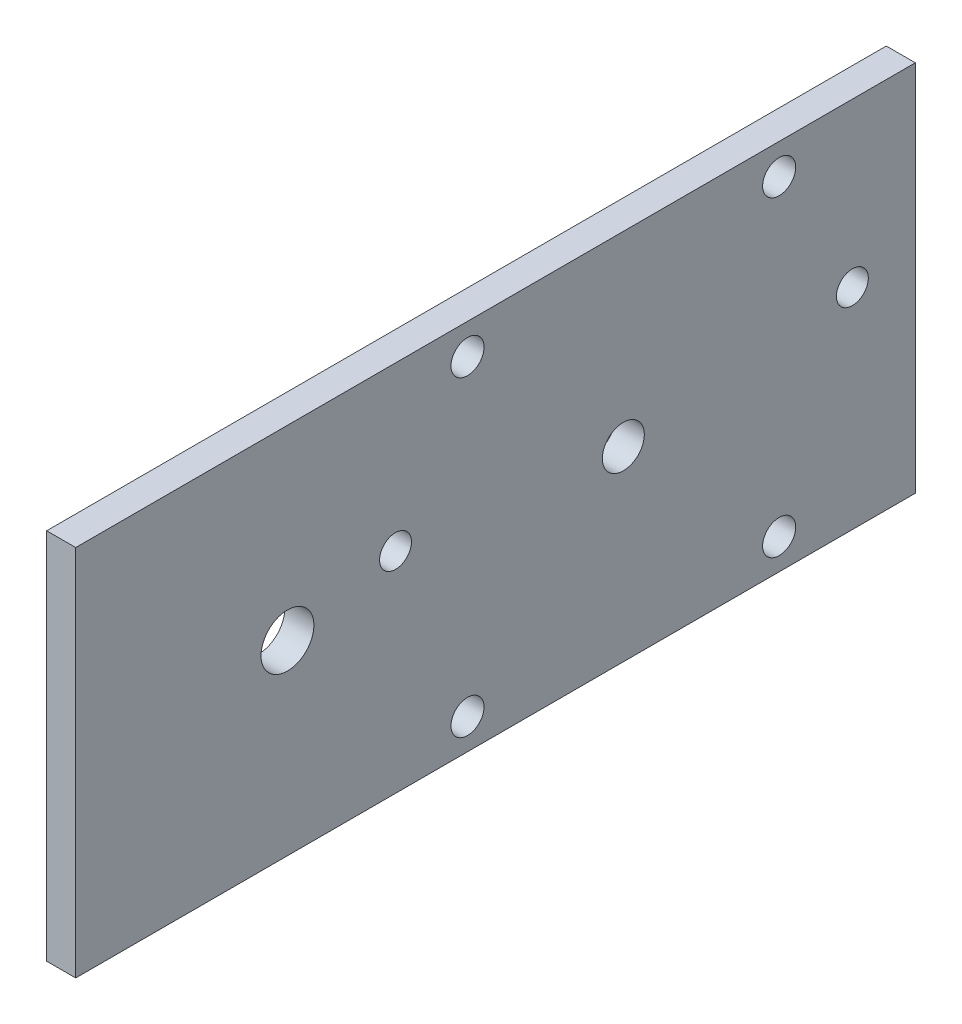
ISO-10303-21;
HEADER;
FILE_DESCRIPTION(('STEP AP214'),'2;1');
FILE_NAME('part.step','',(''),(''),'','','');
FILE_SCHEMA(('AUTOMOTIVE_DESIGN { 1 0 10303 214 1 1 1 1 }'));
ENDSEC;
DATA;
#1=APPLICATION_CONTEXT('core data for automotive mechanical design processes');
#2=APPLICATION_PROTOCOL_DEFINITION('international standard','automotive_design',2000,#1);
#3=PRODUCT_CONTEXT('',#1,'mechanical');
#4=PRODUCT('Part','Part','',(#3));
#5=PRODUCT_RELATED_PRODUCT_CATEGORY('part','',(#4));
#6=PRODUCT_DEFINITION_FORMATION('','',#4);
#7=PRODUCT_DEFINITION_CONTEXT('part definition',#1,'design');
#8=PRODUCT_DEFINITION('design','',#6,#7);
#9=PRODUCT_DEFINITION_SHAPE('','',#8);
#10=(LENGTH_UNIT() NAMED_UNIT(*) SI_UNIT(.MILLI.,.METRE.));
#11=(NAMED_UNIT(*) PLANE_ANGLE_UNIT() SI_UNIT($,.RADIAN.));
#12=(NAMED_UNIT(*) SI_UNIT($,.STERADIAN.) SOLID_ANGLE_UNIT());
#13=UNCERTAINTY_MEASURE_WITH_UNIT(LENGTH_MEASURE(1.E-05),#10,'distance_accuracy_value','');
#14=(GEOMETRIC_REPRESENTATION_CONTEXT(3) GLOBAL_UNCERTAINTY_ASSIGNED_CONTEXT((#13)) GLOBAL_UNIT_ASSIGNED_CONTEXT((#10,
#11,#12)) REPRESENTATION_CONTEXT('',''));
#15=CARTESIAN_POINT('',(0.,0.,0.));
#16=DIRECTION('',(0.,0.,1.));
#17=DIRECTION('',(1.,0.,0.));
#18=AXIS2_PLACEMENT_3D('',#15,#16,#17);
#19=CARTESIAN_POINT('',(4.3942,0.,127.));
#20=DIRECTION('',(0.,1.,0.));
#21=DIRECTION('',(-1.,0.,0.));
#22=AXIS2_PLACEMENT_3D('',#19,#20,#21);
#23=PLANE('',#22);
#24=DIRECTION('',(1.,0.,0.));
#25=VECTOR('',#24,1.);
#26=CARTESIAN_POINT('',(4.3942,0.,0.));
#27=LINE('',#26,#25);
#28=CARTESIAN_POINT('',(0.,0.,0.));
#29=VERTEX_POINT('',#28);
#30=CARTESIAN_POINT('',(4.3942,0.,0.));
#31=VERTEX_POINT('',#30);
#32=EDGE_CURVE('E96',#29,#31,#27,.T.);
#33=ORIENTED_EDGE('',*,*,#32,.T.);
#34=DIRECTION('',(0.,0.,-1.));
#35=VECTOR('',#34,1.);
#36=CARTESIAN_POINT('',(4.3942,0.,127.));
#37=LINE('',#36,#35);
#38=CARTESIAN_POINT('',(4.3942,0.,127.));
#39=VERTEX_POINT('',#38);
#40=EDGE_CURVE('E11',#39,#31,#37,.T.);
#41=ORIENTED_EDGE('',*,*,#40,.F.);
#42=DIRECTION('',(1.,0.,0.));
#43=VECTOR('',#42,1.);
#44=CARTESIAN_POINT('',(4.3942,0.,127.));
#45=LINE('',#44,#43);
#46=CARTESIAN_POINT('',(0.,0.,127.));
#47=VERTEX_POINT('',#46);
#48=EDGE_CURVE('E84',#47,#39,#45,.T.);
#49=ORIENTED_EDGE('',*,*,#48,.F.);
#50=DIRECTION('',(0.,0.,-1.));
#51=VECTOR('',#50,1.);
#52=CARTESIAN_POINT('',(0.,0.,127.));
#53=LINE('',#52,#51);
#54=EDGE_CURVE('E92',#47,#29,#53,.T.);
#55=ORIENTED_EDGE('',*,*,#54,.T.);
#56=EDGE_LOOP('',(#33,#41,#49,#55));
#57=FACE_BOUND('',#56,.T.);
#58=ADVANCED_FACE('F33',(#57),#23,.F.);
#59=CARTESIAN_POINT('',(4.3942,56.388,127.));
#60=DIRECTION('',(-1.,0.,0.));
#61=DIRECTION('',(0.,-1.,0.));
#62=AXIS2_PLACEMENT_3D('',#59,#60,#61);
#63=PLANE('',#62);
#64=CARTESIAN_POINT('',(4.3942,51.772399884,20.5994));
#65=DIRECTION('',(-1.,0.,0.));
#66=DIRECTION('',(0.,0.,1.));
#67=AXIS2_PLACEMENT_3D('',#64,#65,#66);
#68=CIRCLE('',#67,2.5);
#69=CARTESIAN_POINT('',(4.3942,51.772399884,23.0994));
#70=VERTEX_POINT('',#69);
#71=EDGE_CURVE('E149',#70,#70,#68,.T.);
#72=ORIENTED_EDGE('',*,*,#71,.T.);
#73=EDGE_LOOP('',(#72));
#74=FACE_BOUND('',#73,.T.);
#75=CARTESIAN_POINT('',(4.3942,51.772399884,67.7394));
#76=DIRECTION('',(-1.,0.,0.));
#77=DIRECTION('',(0.,0.,1.));
#78=AXIS2_PLACEMENT_3D('',#75,#76,#77);
#79=CIRCLE('',#78,2.5);
#80=CARTESIAN_POINT('',(4.3942,51.772399884,70.2394));
#81=VERTEX_POINT('',#80);
#82=EDGE_CURVE('E143',#81,#81,#79,.T.);
#83=ORIENTED_EDGE('',*,*,#82,.T.);
#84=EDGE_LOOP('',(#83));
#85=FACE_BOUND('',#84,.T.);
#86=CARTESIAN_POINT('',(4.3942,28.199999884,94.9706));
#87=DIRECTION('',(-1.,0.,0.));
#88=DIRECTION('',(0.,0.,1.));
#89=AXIS2_PLACEMENT_3D('',#86,#87,#88);
#90=CIRCLE('',#89,4.00000000000001);
#91=CARTESIAN_POINT('',(4.3942,28.199999884,98.9706));
#92=VERTEX_POINT('',#91);
#93=EDGE_CURVE('E137',#92,#92,#90,.T.);
#94=ORIENTED_EDGE('',*,*,#93,.T.);
#95=EDGE_LOOP('',(#94));
#96=FACE_BOUND('',#95,.T.);
#97=CARTESIAN_POINT('',(4.3942,28.199999884,44.1706));
#98=DIRECTION('',(-1.,0.,0.));
#99=DIRECTION('',(0.,0.,1.));
#100=AXIS2_PLACEMENT_3D('',#97,#98,#99);
#101=CIRCLE('',#100,3.175);
#102=CARTESIAN_POINT('',(4.3942,28.199999884,47.3456));
#103=VERTEX_POINT('',#102);
#104=EDGE_CURVE('E131',#103,#103,#101,.T.);
#105=ORIENTED_EDGE('',*,*,#104,.T.);
#106=EDGE_LOOP('',(#105));
#107=FACE_BOUND('',#106,.T.);
#108=CARTESIAN_POINT('',(4.3942,31.75,78.625));
#109=DIRECTION('',(-1.,0.,0.));
#110=DIRECTION('',(0.,0.,1.));
#111=AXIS2_PLACEMENT_3D('',#108,#109,#110);
#112=CIRCLE('',#111,2.41299999999999);
#113=CARTESIAN_POINT('',(4.3942,31.75,81.038));
#114=VERTEX_POINT('',#113);
#115=EDGE_CURVE('E125',#114,#114,#112,.T.);
#116=ORIENTED_EDGE('',*,*,#115,.T.);
#117=EDGE_LOOP('',(#116));
#118=FACE_BOUND('',#117,.T.);
#119=CARTESIAN_POINT('',(4.3942,4.629999884,67.7394));
#120=DIRECTION('',(-1.,0.,0.));
#121=DIRECTION('',(0.,0.,1.));
#122=AXIS2_PLACEMENT_3D('',#119,#120,#121);
#123=CIRCLE('',#122,2.5);
#124=CARTESIAN_POINT('',(4.3942,4.629999884,70.2394));
#125=VERTEX_POINT('',#124);
#126=EDGE_CURVE('E119',#125,#125,#123,.T.);
#127=ORIENTED_EDGE('',*,*,#126,.T.);
#128=EDGE_LOOP('',(#127));
#129=FACE_BOUND('',#128,.T.);
#130=CARTESIAN_POINT('',(4.3942,31.75,9.52500000000001));
#131=DIRECTION('',(-1.,0.,0.));
#132=DIRECTION('',(0.,0.,1.));
#133=AXIS2_PLACEMENT_3D('',#130,#131,#132);
#134=CIRCLE('',#133,2.413);
#135=CARTESIAN_POINT('',(4.3942,31.75,11.938));
#136=VERTEX_POINT('',#135);
#137=EDGE_CURVE('E113',#136,#136,#134,.T.);
#138=ORIENTED_EDGE('',*,*,#137,.T.);
#139=EDGE_LOOP('',(#138));
#140=FACE_BOUND('',#139,.T.);
#141=CARTESIAN_POINT('',(4.3942,4.629999884,20.5994));
#142=DIRECTION('',(-1.,0.,0.));
#143=DIRECTION('',(0.,0.,1.));
#144=AXIS2_PLACEMENT_3D('',#141,#142,#143);
#145=CIRCLE('',#144,2.5);
#146=CARTESIAN_POINT('',(4.3942,4.629999884,23.0994));
#147=VERTEX_POINT('',#146);
#148=EDGE_CURVE('E99',#147,#147,#145,.T.);
#149=ORIENTED_EDGE('',*,*,#148,.T.);
#150=EDGE_LOOP('',(#149));
#151=FACE_BOUND('',#150,.T.);
#152=DIRECTION('',(0.,1.,0.));
#153=VECTOR('',#152,1.);
#154=CARTESIAN_POINT('',(4.3942,56.388,0.));
#155=LINE('',#154,#153);
#156=CARTESIAN_POINT('',(4.3942,56.388,0.));
#157=VERTEX_POINT('',#156);
#158=EDGE_CURVE('E88',#31,#157,#155,.T.);
#159=ORIENTED_EDGE('',*,*,#158,.T.);
#160=DIRECTION('',(0.,0.,-1.));
#161=VECTOR('',#160,1.);
#162=CARTESIAN_POINT('',(4.3942,56.388,127.));
#163=LINE('',#162,#161);
#164=CARTESIAN_POINT('',(4.3942,56.388,127.));
#165=VERTEX_POINT('',#164);
#166=EDGE_CURVE('E41',#165,#157,#163,.T.);
#167=ORIENTED_EDGE('',*,*,#166,.F.);
#168=DIRECTION('',(0.,1.,0.));
#169=VECTOR('',#168,1.);
#170=CARTESIAN_POINT('',(4.3942,56.388,127.));
#171=LINE('',#170,#169);
#172=EDGE_CURVE('E79',#39,#165,#171,.T.);
#173=ORIENTED_EDGE('',*,*,#172,.F.);
#174=ORIENTED_EDGE('',*,*,#40,.T.);
#175=EDGE_LOOP('',(#159,#167,#173,#174));
#176=FACE_BOUND('',#175,.T.);
#177=ADVANCED_FACE('F87',(#74,#85,#96,#107,#118,#129,#140,#151,#176),#63,.F.);
#178=CARTESIAN_POINT('',(0.,56.388,127.));
#179=DIRECTION('',(0.,-1.,0.));
#180=DIRECTION('',(0.,0.,-1.));
#181=AXIS2_PLACEMENT_3D('',#178,#179,#180);
#182=PLANE('',#181);
#183=DIRECTION('',(-1.,0.,0.));
#184=VECTOR('',#183,1.);
#185=CARTESIAN_POINT('',(0.,56.388,0.));
#186=LINE('',#185,#184);
#187=CARTESIAN_POINT('',(0.,56.388,0.));
#188=VERTEX_POINT('',#187);
#189=EDGE_CURVE('E66',#157,#188,#186,.T.);
#190=ORIENTED_EDGE('',*,*,#189,.T.);
#191=DIRECTION('',(0.,0.,-1.));
#192=VECTOR('',#191,1.);
#193=CARTESIAN_POINT('',(0.,56.388,127.));
#194=LINE('',#193,#192);
#195=CARTESIAN_POINT('',(0.,56.388,127.));
#196=VERTEX_POINT('',#195);
#197=EDGE_CURVE('E89',#196,#188,#194,.T.);
#198=ORIENTED_EDGE('',*,*,#197,.F.);
#199=DIRECTION('',(-1.,0.,0.));
#200=VECTOR('',#199,1.);
#201=CARTESIAN_POINT('',(0.,56.388,127.));
#202=LINE('',#201,#200);
#203=EDGE_CURVE('E82',#165,#196,#202,.T.);
#204=ORIENTED_EDGE('',*,*,#203,.F.);
#205=ORIENTED_EDGE('',*,*,#166,.T.);
#206=EDGE_LOOP('',(#190,#198,#204,#205));
#207=FACE_BOUND('',#206,.T.);
#208=ADVANCED_FACE('F90',(#207),#182,.F.);
#209=CARTESIAN_POINT('',(0.,0.,127.));
#210=DIRECTION('',(1.,0.,0.));
#211=DIRECTION('',(0.,0.,-1.));
#212=AXIS2_PLACEMENT_3D('',#209,#210,#211);
#213=PLANE('',#212);
#214=CARTESIAN_POINT('',(0.,51.772399884,20.5994));
#215=DIRECTION('',(-1.,0.,0.));
#216=DIRECTION('',(0.,0.,1.));
#217=AXIS2_PLACEMENT_3D('',#214,#215,#216);
#218=CIRCLE('',#217,2.5);
#219=CARTESIAN_POINT('',(0.,51.772399884,23.0994));
#220=VERTEX_POINT('',#219);
#221=EDGE_CURVE('E152',#220,#220,#218,.T.);
#222=ORIENTED_EDGE('',*,*,#221,.F.);
#223=EDGE_LOOP('',(#222));
#224=FACE_BOUND('',#223,.T.);
#225=CARTESIAN_POINT('',(0.,51.772399884,67.7394));
#226=DIRECTION('',(-1.,0.,0.));
#227=DIRECTION('',(0.,0.,1.));
#228=AXIS2_PLACEMENT_3D('',#225,#226,#227);
#229=CIRCLE('',#228,2.5);
#230=CARTESIAN_POINT('',(0.,51.772399884,70.2394));
#231=VERTEX_POINT('',#230);
#232=EDGE_CURVE('E146',#231,#231,#229,.T.);
#233=ORIENTED_EDGE('',*,*,#232,.F.);
#234=EDGE_LOOP('',(#233));
#235=FACE_BOUND('',#234,.T.);
#236=CARTESIAN_POINT('',(0.,28.199999884,94.9706));
#237=DIRECTION('',(-1.,0.,0.));
#238=DIRECTION('',(0.,0.,1.));
#239=AXIS2_PLACEMENT_3D('',#236,#237,#238);
#240=CIRCLE('',#239,4.00000000000001);
#241=CARTESIAN_POINT('',(0.,28.199999884,98.9706));
#242=VERTEX_POINT('',#241);
#243=EDGE_CURVE('E140',#242,#242,#240,.T.);
#244=ORIENTED_EDGE('',*,*,#243,.F.);
#245=EDGE_LOOP('',(#244));
#246=FACE_BOUND('',#245,.T.);
#247=CARTESIAN_POINT('',(0.,28.199999884,44.1706));
#248=DIRECTION('',(-1.,0.,0.));
#249=DIRECTION('',(0.,0.,1.));
#250=AXIS2_PLACEMENT_3D('',#247,#248,#249);
#251=CIRCLE('',#250,3.175);
#252=CARTESIAN_POINT('',(0.,28.199999884,47.3456));
#253=VERTEX_POINT('',#252);
#254=EDGE_CURVE('E134',#253,#253,#251,.T.);
#255=ORIENTED_EDGE('',*,*,#254,.F.);
#256=EDGE_LOOP('',(#255));
#257=FACE_BOUND('',#256,.T.);
#258=CARTESIAN_POINT('',(0.,31.75,78.625));
#259=DIRECTION('',(-1.,0.,0.));
#260=DIRECTION('',(0.,0.,1.));
#261=AXIS2_PLACEMENT_3D('',#258,#259,#260);
#262=CIRCLE('',#261,2.41299999999999);
#263=CARTESIAN_POINT('',(0.,31.75,81.038));
#264=VERTEX_POINT('',#263);
#265=EDGE_CURVE('E128',#264,#264,#262,.T.);
#266=ORIENTED_EDGE('',*,*,#265,.F.);
#267=EDGE_LOOP('',(#266));
#268=FACE_BOUND('',#267,.T.);
#269=CARTESIAN_POINT('',(0.,4.629999884,67.7394));
#270=DIRECTION('',(-1.,0.,0.));
#271=DIRECTION('',(0.,0.,1.));
#272=AXIS2_PLACEMENT_3D('',#269,#270,#271);
#273=CIRCLE('',#272,2.5);
#274=CARTESIAN_POINT('',(0.,4.629999884,70.2394));
#275=VERTEX_POINT('',#274);
#276=EDGE_CURVE('E122',#275,#275,#273,.T.);
#277=ORIENTED_EDGE('',*,*,#276,.F.);
#278=EDGE_LOOP('',(#277));
#279=FACE_BOUND('',#278,.T.);
#280=CARTESIAN_POINT('',(0.,31.75,9.52500000000001));
#281=DIRECTION('',(-1.,0.,0.));
#282=DIRECTION('',(0.,0.,1.));
#283=AXIS2_PLACEMENT_3D('',#280,#281,#282);
#284=CIRCLE('',#283,2.413);
#285=CARTESIAN_POINT('',(0.,31.75,11.938));
#286=VERTEX_POINT('',#285);
#287=EDGE_CURVE('E116',#286,#286,#284,.T.);
#288=ORIENTED_EDGE('',*,*,#287,.F.);
#289=EDGE_LOOP('',(#288));
#290=FACE_BOUND('',#289,.T.);
#291=CARTESIAN_POINT('',(0.,4.629999884,20.5994));
#292=DIRECTION('',(-1.,0.,0.));
#293=DIRECTION('',(0.,0.,1.));
#294=AXIS2_PLACEMENT_3D('',#291,#292,#293);
#295=CIRCLE('',#294,2.5);
#296=CARTESIAN_POINT('',(0.,4.629999884,23.0994));
#297=VERTEX_POINT('',#296);
#298=EDGE_CURVE('E110',#297,#297,#295,.T.);
#299=ORIENTED_EDGE('',*,*,#298,.F.);
#300=EDGE_LOOP('',(#299));
#301=FACE_BOUND('',#300,.T.);
#302=DIRECTION('',(0.,-1.,0.));
#303=VECTOR('',#302,1.);
#304=CARTESIAN_POINT('',(0.,0.,0.));
#305=LINE('',#304,#303);
#306=EDGE_CURVE('E72',#188,#29,#305,.T.);
#307=ORIENTED_EDGE('',*,*,#306,.T.);
#308=ORIENTED_EDGE('',*,*,#54,.F.);
#309=DIRECTION('',(0.,-1.,0.));
#310=VECTOR('',#309,1.);
#311=CARTESIAN_POINT('',(0.,0.,127.));
#312=LINE('',#311,#310);
#313=EDGE_CURVE('E49',#196,#47,#312,.T.);
#314=ORIENTED_EDGE('',*,*,#313,.F.);
#315=ORIENTED_EDGE('',*,*,#197,.T.);
#316=EDGE_LOOP('',(#307,#308,#314,#315));
#317=FACE_BOUND('',#316,.T.);
#318=ADVANCED_FACE('F104',(#224,#235,#246,#257,#268,#279,#290,#301,#317),#213,.F.);
#319=CARTESIAN_POINT('',(0.,0.,127.));
#320=DIRECTION('',(0.,0.,-1.));
#321=DIRECTION('',(-1.,0.,0.));
#322=AXIS2_PLACEMENT_3D('',#319,#320,#321);
#323=PLANE('',#322);
#324=ORIENTED_EDGE('',*,*,#48,.T.);
#325=ORIENTED_EDGE('',*,*,#172,.T.);
#326=ORIENTED_EDGE('',*,*,#203,.T.);
#327=ORIENTED_EDGE('',*,*,#313,.T.);
#328=EDGE_LOOP('',(#324,#325,#326,#327));
#329=FACE_BOUND('',#328,.T.);
#330=ADVANCED_FACE('F80',(#329),#323,.F.);
#331=CARTESIAN_POINT('',(0.,0.,0.));
#332=DIRECTION('',(0.,0.,-1.));
#333=DIRECTION('',(-1.,0.,0.));
#334=AXIS2_PLACEMENT_3D('',#331,#332,#333);
#335=PLANE('',#334);
#336=ORIENTED_EDGE('',*,*,#32,.F.);
#337=ORIENTED_EDGE('',*,*,#306,.F.);
#338=ORIENTED_EDGE('',*,*,#189,.F.);
#339=ORIENTED_EDGE('',*,*,#158,.F.);
#340=EDGE_LOOP('',(#336,#337,#338,#339));
#341=FACE_BOUND('',#340,.T.);
#342=ADVANCED_FACE('F107',(#341),#335,.T.);
#343=CARTESIAN_POINT('',(4.3942,4.629999884,20.5994));
#344=DIRECTION('',(-1.,0.,0.));
#345=DIRECTION('',(0.,0.,1.));
#346=AXIS2_PLACEMENT_3D('',#343,#344,#345);
#347=CYLINDRICAL_SURFACE('',#346,2.5);
#348=ORIENTED_EDGE('',*,*,#148,.F.);
#349=EDGE_LOOP('',(#348));
#350=FACE_BOUND('',#349,.T.);
#351=ORIENTED_EDGE('',*,*,#298,.T.);
#352=EDGE_LOOP('',(#351));
#353=FACE_BOUND('',#352,.T.);
#354=ADVANCED_FACE('F184',(#350,#353),#347,.F.);
#355=CARTESIAN_POINT('',(4.3942,31.75,9.52500000000001));
#356=DIRECTION('',(-1.,0.,0.));
#357=DIRECTION('',(0.,0.,1.));
#358=AXIS2_PLACEMENT_3D('',#355,#356,#357);
#359=CYLINDRICAL_SURFACE('',#358,2.413);
#360=ORIENTED_EDGE('',*,*,#137,.F.);
#361=EDGE_LOOP('',(#360));
#362=FACE_BOUND('',#361,.T.);
#363=ORIENTED_EDGE('',*,*,#287,.T.);
#364=EDGE_LOOP('',(#363));
#365=FACE_BOUND('',#364,.T.);
#366=ADVANCED_FACE('F186',(#362,#365),#359,.F.);
#367=CARTESIAN_POINT('',(4.3942,4.629999884,67.7394));
#368=DIRECTION('',(-1.,0.,0.));
#369=DIRECTION('',(0.,0.,1.));
#370=AXIS2_PLACEMENT_3D('',#367,#368,#369);
#371=CYLINDRICAL_SURFACE('',#370,2.5);
#372=ORIENTED_EDGE('',*,*,#126,.F.);
#373=EDGE_LOOP('',(#372));
#374=FACE_BOUND('',#373,.T.);
#375=ORIENTED_EDGE('',*,*,#276,.T.);
#376=EDGE_LOOP('',(#375));
#377=FACE_BOUND('',#376,.T.);
#378=ADVANCED_FACE('F193',(#374,#377),#371,.F.);
#379=CARTESIAN_POINT('',(4.3942,31.75,78.625));
#380=DIRECTION('',(-1.,0.,0.));
#381=DIRECTION('',(0.,0.,1.));
#382=AXIS2_PLACEMENT_3D('',#379,#380,#381);
#383=CYLINDRICAL_SURFACE('',#382,2.41299999999999);
#384=ORIENTED_EDGE('',*,*,#115,.F.);
#385=EDGE_LOOP('',(#384));
#386=FACE_BOUND('',#385,.T.);
#387=ORIENTED_EDGE('',*,*,#265,.T.);
#388=EDGE_LOOP('',(#387));
#389=FACE_BOUND('',#388,.T.);
#390=ADVANCED_FACE('F246',(#386,#389),#383,.F.);
#391=CARTESIAN_POINT('',(4.3942,28.199999884,44.1706));
#392=DIRECTION('',(-1.,0.,0.));
#393=DIRECTION('',(0.,0.,1.));
#394=AXIS2_PLACEMENT_3D('',#391,#392,#393);
#395=CYLINDRICAL_SURFACE('',#394,3.175);
#396=ORIENTED_EDGE('',*,*,#104,.F.);
#397=EDGE_LOOP('',(#396));
#398=FACE_BOUND('',#397,.T.);
#399=ORIENTED_EDGE('',*,*,#254,.T.);
#400=EDGE_LOOP('',(#399));
#401=FACE_BOUND('',#400,.T.);
#402=ADVANCED_FACE('F256',(#398,#401),#395,.F.);
#403=CARTESIAN_POINT('',(4.3942,28.199999884,94.9706));
#404=DIRECTION('',(-1.,0.,0.));
#405=DIRECTION('',(0.,0.,1.));
#406=AXIS2_PLACEMENT_3D('',#403,#404,#405);
#407=CYLINDRICAL_SURFACE('',#406,4.00000000000001);
#408=ORIENTED_EDGE('',*,*,#93,.F.);
#409=EDGE_LOOP('',(#408));
#410=FACE_BOUND('',#409,.T.);
#411=ORIENTED_EDGE('',*,*,#243,.T.);
#412=EDGE_LOOP('',(#411));
#413=FACE_BOUND('',#412,.T.);
#414=ADVANCED_FACE('F266',(#410,#413),#407,.F.);
#415=CARTESIAN_POINT('',(4.3942,51.772399884,67.7394));
#416=DIRECTION('',(-1.,0.,0.));
#417=DIRECTION('',(0.,0.,1.));
#418=AXIS2_PLACEMENT_3D('',#415,#416,#417);
#419=CYLINDRICAL_SURFACE('',#418,2.5);
#420=ORIENTED_EDGE('',*,*,#82,.F.);
#421=EDGE_LOOP('',(#420));
#422=FACE_BOUND('',#421,.T.);
#423=ORIENTED_EDGE('',*,*,#232,.T.);
#424=EDGE_LOOP('',(#423));
#425=FACE_BOUND('',#424,.T.);
#426=ADVANCED_FACE('F163',(#422,#425),#419,.F.);
#427=CARTESIAN_POINT('',(4.3942,51.772399884,20.5994));
#428=DIRECTION('',(-1.,0.,0.));
#429=DIRECTION('',(0.,0.,1.));
#430=AXIS2_PLACEMENT_3D('',#427,#428,#429);
#431=CYLINDRICAL_SURFACE('',#430,2.5);
#432=ORIENTED_EDGE('',*,*,#71,.F.);
#433=EDGE_LOOP('',(#432));
#434=FACE_BOUND('',#433,.T.);
#435=ORIENTED_EDGE('',*,*,#221,.T.);
#436=EDGE_LOOP('',(#435));
#437=FACE_BOUND('',#436,.T.);
#438=ADVANCED_FACE('F160',(#434,#437),#431,.F.);
#439=CLOSED_SHELL('',(#58,#177,#208,#318,#330,#342,#354,#366,#378,#390,#402,#414,#426,#438));
#440=MANIFOLD_SOLID_BREP('B2',#439);
#441=ADVANCED_BREP_SHAPE_REPRESENTATION('',(#18,#440),#14);
#442=SHAPE_DEFINITION_REPRESENTATION(#9,#441);
ENDSEC;
END-ISO-10303-21;
